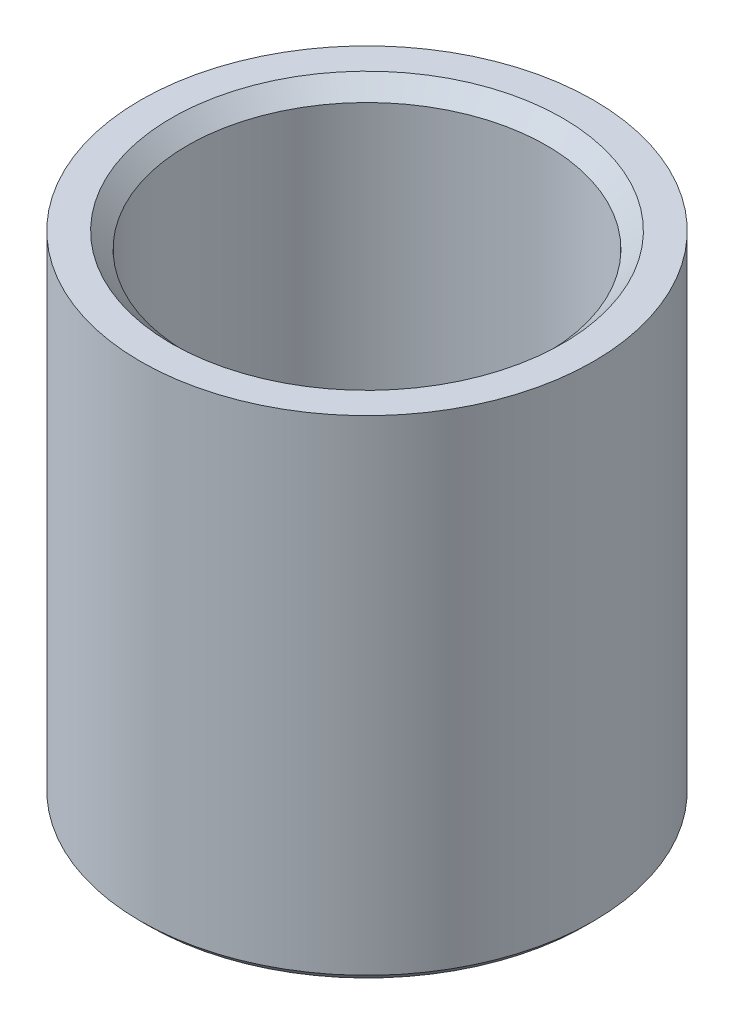
ISO-10303-21;
HEADER;
FILE_DESCRIPTION(('STEP AP214'),'2;1');
FILE_NAME('part.step','',(''),(''),'','','');
FILE_SCHEMA(('AUTOMOTIVE_DESIGN { 1 0 10303 214 1 1 1 1 }'));
ENDSEC;
DATA;
#1=APPLICATION_CONTEXT('core data for automotive mechanical design processes');
#2=APPLICATION_PROTOCOL_DEFINITION('international standard','automotive_design',2000,#1);
#3=PRODUCT_CONTEXT('',#1,'mechanical');
#4=PRODUCT('Part','Part','',(#3));
#5=PRODUCT_RELATED_PRODUCT_CATEGORY('part','',(#4));
#6=PRODUCT_DEFINITION_FORMATION('','',#4);
#7=PRODUCT_DEFINITION_CONTEXT('part definition',#1,'design');
#8=PRODUCT_DEFINITION('design','',#6,#7);
#9=PRODUCT_DEFINITION_SHAPE('','',#8);
#10=(LENGTH_UNIT() NAMED_UNIT(*) SI_UNIT(.MILLI.,.METRE.));
#11=(NAMED_UNIT(*) PLANE_ANGLE_UNIT() SI_UNIT($,.RADIAN.));
#12=(NAMED_UNIT(*) SI_UNIT($,.STERADIAN.) SOLID_ANGLE_UNIT());
#13=UNCERTAINTY_MEASURE_WITH_UNIT(LENGTH_MEASURE(1.E-05),#10,'distance_accuracy_value','');
#14=(GEOMETRIC_REPRESENTATION_CONTEXT(3) GLOBAL_UNCERTAINTY_ASSIGNED_CONTEXT((#13)) GLOBAL_UNIT_ASSIGNED_CONTEXT((#10,
#11,#12)) REPRESENTATION_CONTEXT('',''));
#15=CARTESIAN_POINT('',(0.,0.,0.));
#16=DIRECTION('',(0.,0.,1.));
#17=DIRECTION('',(1.,0.,0.));
#18=AXIS2_PLACEMENT_3D('',#15,#16,#17);
#19=CARTESIAN_POINT('',(0.,62.,0.));
#20=DIRECTION('',(0.,1.,0.));
#21=DIRECTION('',(0.,0.,1.));
#22=AXIS2_PLACEMENT_3D('',#19,#20,#21);
#23=PLANE('',#22);
#24=CARTESIAN_POINT('',(0.,62.,0.));
#25=DIRECTION('',(0.,1.,0.));
#26=DIRECTION('',(0.,0.,1.));
#27=AXIS2_PLACEMENT_3D('',#24,#25,#26);
#28=CIRCLE('',#27,24.6);
#29=CARTESIAN_POINT('',(0.,62.,24.6));
#30=VERTEX_POINT('',#29);
#31=EDGE_CURVE('E60',#30,#30,#28,.F.);
#32=ORIENTED_EDGE('',*,*,#31,.T.);
#33=EDGE_LOOP('',(#32));
#34=FACE_BOUND('',#33,.T.);
#35=CARTESIAN_POINT('',(0.,62.,0.));
#36=DIRECTION('',(0.,1.,0.));
#37=DIRECTION('',(0.,0.,1.));
#38=AXIS2_PLACEMENT_3D('',#35,#36,#37);
#39=CIRCLE('',#38,28.5);
#40=CARTESIAN_POINT('',(0.,62.,28.5));
#41=VERTEX_POINT('',#40);
#42=EDGE_CURVE('E66',#41,#41,#39,.T.);
#43=ORIENTED_EDGE('',*,*,#42,.T.);
#44=EDGE_LOOP('',(#43));
#45=FACE_BOUND('',#44,.T.);
#46=ADVANCED_FACE('F39',(#34,#45),#23,.T.);
#47=CARTESIAN_POINT('',(0.,0.,0.));
#48=DIRECTION('',(0.,1.,0.));
#49=DIRECTION('',(0.,0.,1.));
#50=AXIS2_PLACEMENT_3D('',#47,#48,#49);
#51=PLANE('',#50);
#52=CARTESIAN_POINT('',(0.,0.,0.));
#53=DIRECTION('',(0.,1.,0.));
#54=DIRECTION('',(0.,0.,1.));
#55=AXIS2_PLACEMENT_3D('',#52,#53,#54);
#56=CIRCLE('',#55,27.5);
#57=CARTESIAN_POINT('',(0.,0.,27.5));
#58=VERTEX_POINT('',#57);
#59=EDGE_CURVE('E10',#58,#58,#56,.F.);
#60=ORIENTED_EDGE('',*,*,#59,.T.);
#61=EDGE_LOOP('',(#60));
#62=FACE_BOUND('',#61,.T.);
#63=CARTESIAN_POINT('',(0.,0.,0.));
#64=DIRECTION('',(0.,1.,0.));
#65=DIRECTION('',(0.,0.,1.));
#66=AXIS2_PLACEMENT_3D('',#63,#64,#65);
#67=CIRCLE('',#66,23.6);
#68=CARTESIAN_POINT('',(0.,0.,23.6));
#69=VERTEX_POINT('',#68);
#70=EDGE_CURVE('E55',#69,#69,#67,.T.);
#71=ORIENTED_EDGE('',*,*,#70,.T.);
#72=EDGE_LOOP('',(#71));
#73=FACE_BOUND('',#72,.T.);
#74=ADVANCED_FACE('F74',(#62,#73),#51,.F.);
#75=CARTESIAN_POINT('',(0.,62.,0.));
#76=DIRECTION('',(0.,-1.,0.));
#77=DIRECTION('',(0.,0.,-1.));
#78=AXIS2_PLACEMENT_3D('',#75,#76,#77);
#79=CYLINDRICAL_SURFACE('',#78,28.5);
#80=CARTESIAN_POINT('',(0.,1.00000000000001,0.));
#81=DIRECTION('',(0.,1.,0.));
#82=DIRECTION('',(0.,0.,1.));
#83=AXIS2_PLACEMENT_3D('',#80,#81,#82);
#84=CIRCLE('',#83,28.5);
#85=CARTESIAN_POINT('',(0.,1.00000000000001,28.5));
#86=VERTEX_POINT('',#85);
#87=EDGE_CURVE('E47',#86,#86,#84,.T.);
#88=ORIENTED_EDGE('',*,*,#87,.T.);
#89=EDGE_LOOP('',(#88));
#90=FACE_BOUND('',#89,.T.);
#91=ORIENTED_EDGE('',*,*,#42,.F.);
#92=EDGE_LOOP('',(#91));
#93=FACE_BOUND('',#92,.T.);
#94=ADVANCED_FACE('F71',(#90,#93),#79,.T.);
#95=CARTESIAN_POINT('',(0.,62.,0.));
#96=DIRECTION('',(0.,-1.,0.));
#97=DIRECTION('',(0.,0.,-1.));
#98=AXIS2_PLACEMENT_3D('',#95,#96,#97);
#99=CYLINDRICAL_SURFACE('',#98,22.6);
#100=CARTESIAN_POINT('',(0.,1.,0.));
#101=DIRECTION('',(0.,1.,0.));
#102=DIRECTION('',(0.,0.,1.));
#103=AXIS2_PLACEMENT_3D('',#100,#101,#102);
#104=CIRCLE('',#103,22.6);
#105=CARTESIAN_POINT('',(0.,1.,22.6));
#106=VERTEX_POINT('',#105);
#107=EDGE_CURVE('E51',#106,#106,#104,.F.);
#108=ORIENTED_EDGE('',*,*,#107,.T.);
#109=EDGE_LOOP('',(#108));
#110=FACE_BOUND('',#109,.T.);
#111=CARTESIAN_POINT('',(0.,60.,0.));
#112=DIRECTION('',(0.,1.,0.));
#113=DIRECTION('',(0.,0.,1.));
#114=AXIS2_PLACEMENT_3D('',#111,#112,#113);
#115=CIRCLE('',#114,22.6);
#116=CARTESIAN_POINT('',(0.,60.,22.6));
#117=VERTEX_POINT('',#116);
#118=EDGE_CURVE('E63',#117,#117,#115,.T.);
#119=ORIENTED_EDGE('',*,*,#118,.T.);
#120=EDGE_LOOP('',(#119));
#121=FACE_BOUND('',#120,.T.);
#122=ADVANCED_FACE('F73',(#110,#121),#99,.F.);
#123=CARTESIAN_POINT('',(0.,60.,0.));
#124=DIRECTION('',(0.,1.,0.));
#125=DIRECTION('',(0.,0.,1.));
#126=AXIS2_PLACEMENT_3D('',#123,#124,#125);
#127=CONICAL_SURFACE('',#126,22.6,0.78539816339745);
#128=ORIENTED_EDGE('',*,*,#31,.F.);
#129=EDGE_LOOP('',(#128));
#130=FACE_BOUND('',#129,.T.);
#131=ORIENTED_EDGE('',*,*,#118,.F.);
#132=EDGE_LOOP('',(#131));
#133=FACE_BOUND('',#132,.T.);
#134=ADVANCED_FACE('F81',(#130,#133),#127,.F.);
#135=CARTESIAN_POINT('',(0.,0.,0.));
#136=DIRECTION('',(0.,-1.,0.));
#137=DIRECTION('',(0.,0.,-1.));
#138=AXIS2_PLACEMENT_3D('',#135,#136,#137);
#139=CONICAL_SURFACE('',#138,23.6,0.785398163397452);
#140=ORIENTED_EDGE('',*,*,#107,.F.);
#141=EDGE_LOOP('',(#140));
#142=FACE_BOUND('',#141,.T.);
#143=ORIENTED_EDGE('',*,*,#70,.F.);
#144=EDGE_LOOP('',(#143));
#145=FACE_BOUND('',#144,.T.);
#146=ADVANCED_FACE('F95',(#142,#145),#139,.F.);
#147=CARTESIAN_POINT('',(0.,1.00000000000001,0.));
#148=DIRECTION('',(0.,1.,0.));
#149=DIRECTION('',(0.,0.,1.));
#150=AXIS2_PLACEMENT_3D('',#147,#148,#149);
#151=CONICAL_SURFACE('',#150,28.5,0.785398163397445);
#152=ORIENTED_EDGE('',*,*,#59,.F.);
#153=EDGE_LOOP('',(#152));
#154=FACE_BOUND('',#153,.T.);
#155=ORIENTED_EDGE('',*,*,#87,.F.);
#156=EDGE_LOOP('',(#155));
#157=FACE_BOUND('',#156,.T.);
#158=ADVANCED_FACE('F42',(#154,#157),#151,.T.);
#159=CLOSED_SHELL('',(#46,#74,#94,#122,#134,#146,#158));
#160=MANIFOLD_SOLID_BREP('B2',#159);
#161=ADVANCED_BREP_SHAPE_REPRESENTATION('',(#18,#160),#14);
#162=SHAPE_DEFINITION_REPRESENTATION(#9,#161);
ENDSEC;
END-ISO-10303-21;
